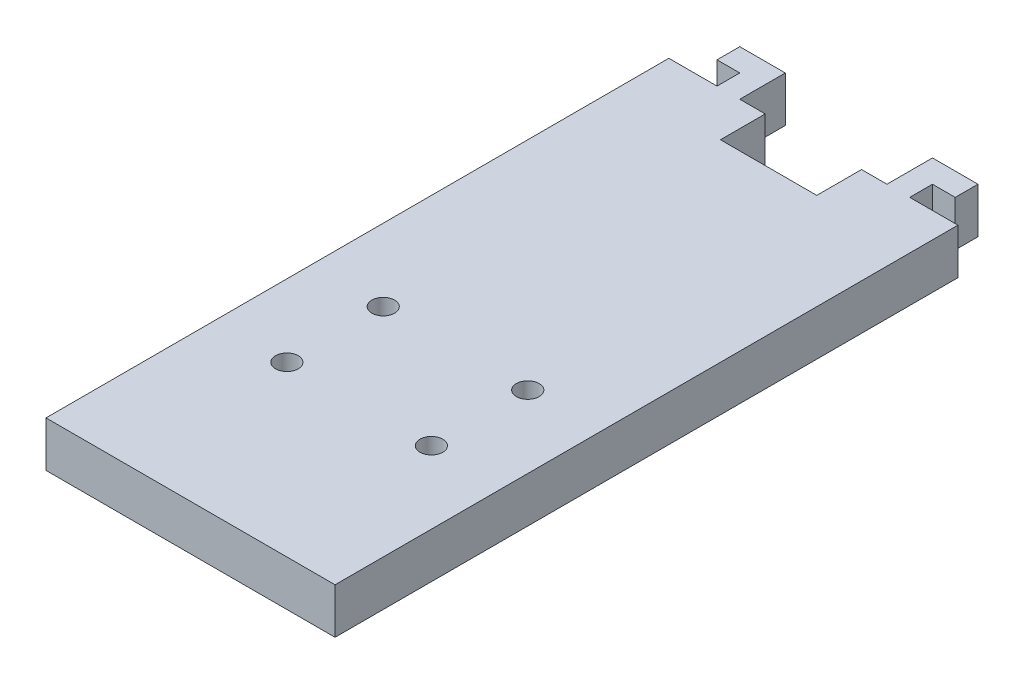
ISO-10303-21;
HEADER;
FILE_DESCRIPTION(('STEP AP214'),'2;1');
FILE_NAME('part.step','',(''),(''),'','','');
FILE_SCHEMA(('AUTOMOTIVE_DESIGN { 1 0 10303 214 1 1 1 1 }'));
ENDSEC;
DATA;
#1=APPLICATION_CONTEXT('core data for automotive mechanical design processes');
#2=APPLICATION_PROTOCOL_DEFINITION('international standard','automotive_design',2000,#1);
#3=PRODUCT_CONTEXT('',#1,'mechanical');
#4=PRODUCT('Part','Part','',(#3));
#5=PRODUCT_RELATED_PRODUCT_CATEGORY('part','',(#4));
#6=PRODUCT_DEFINITION_FORMATION('','',#4);
#7=PRODUCT_DEFINITION_CONTEXT('part definition',#1,'design');
#8=PRODUCT_DEFINITION('design','',#6,#7);
#9=PRODUCT_DEFINITION_SHAPE('','',#8);
#10=(LENGTH_UNIT() NAMED_UNIT(*) SI_UNIT(.MILLI.,.METRE.));
#11=(NAMED_UNIT(*) PLANE_ANGLE_UNIT() SI_UNIT($,.RADIAN.));
#12=(NAMED_UNIT(*) SI_UNIT($,.STERADIAN.) SOLID_ANGLE_UNIT());
#13=UNCERTAINTY_MEASURE_WITH_UNIT(LENGTH_MEASURE(1.E-05),#10,'distance_accuracy_value','');
#14=(GEOMETRIC_REPRESENTATION_CONTEXT(3) GLOBAL_UNCERTAINTY_ASSIGNED_CONTEXT((#13)) GLOBAL_UNIT_ASSIGNED_CONTEXT((#10,
#11,#12)) REPRESENTATION_CONTEXT('',''));
#15=CARTESIAN_POINT('',(0.,0.,0.));
#16=DIRECTION('',(0.,0.,1.));
#17=DIRECTION('',(1.,0.,0.));
#18=AXIS2_PLACEMENT_3D('',#15,#16,#17);
#19=CARTESIAN_POINT('',(19.0500000000001,2.999999969,0.));
#20=DIRECTION('',(1.,0.,0.));
#21=DIRECTION('',(0.,0.,-1.));
#22=AXIS2_PLACEMENT_3D('',#19,#20,#21);
#23=PLANE('',#22);
#24=DIRECTION('',(0.,0.,1.));
#25=VECTOR('',#24,1.);
#26=CARTESIAN_POINT('',(19.0500000000001,-2.999999969,0.));
#27=LINE('',#26,#25);
#28=CARTESIAN_POINT('',(19.05,-2.999999969,-43.999999884));
#29=VERTEX_POINT('',#28);
#30=CARTESIAN_POINT('',(19.05,-2.999999969,38.1));
#31=VERTEX_POINT('',#30);
#32=EDGE_CURVE('E335',#29,#31,#27,.T.);
#33=ORIENTED_EDGE('',*,*,#32,.F.);
#34=DIRECTION('',(0.,-1.,0.));
#35=VECTOR('',#34,1.);
#36=CARTESIAN_POINT('',(19.05,2.999999969,-43.999999884));
#37=LINE('',#36,#35);
#38=CARTESIAN_POINT('',(19.05,2.999999969,-43.999999884));
#39=VERTEX_POINT('',#38);
#40=EDGE_CURVE('E12',#39,#29,#37,.T.);
#41=ORIENTED_EDGE('',*,*,#40,.F.);
#42=DIRECTION('',(0.,0.,1.));
#43=VECTOR('',#42,1.);
#44=CARTESIAN_POINT('',(19.0500000000001,2.999999969,0.));
#45=LINE('',#44,#43);
#46=CARTESIAN_POINT('',(19.05,2.999999969,38.1));
#47=VERTEX_POINT('',#46);
#48=EDGE_CURVE('E395',#39,#47,#45,.T.);
#49=ORIENTED_EDGE('',*,*,#48,.T.);
#50=DIRECTION('',(0.,-1.,0.));
#51=VECTOR('',#50,1.);
#52=CARTESIAN_POINT('',(19.05,2.999999969,38.1));
#53=LINE('',#52,#51);
#54=EDGE_CURVE('E138',#47,#31,#53,.T.);
#55=ORIENTED_EDGE('',*,*,#54,.T.);
#56=EDGE_LOOP('',(#33,#41,#49,#55));
#57=FACE_BOUND('',#56,.T.);
#58=ADVANCED_FACE('F50',(#57),#23,.T.);
#59=CARTESIAN_POINT('',(0.,2.999999969,-43.999999884));
#60=DIRECTION('',(0.,0.,-1.));
#61=DIRECTION('',(-1.,0.,0.));
#62=AXIS2_PLACEMENT_3D('',#59,#60,#61);
#63=PLANE('',#62);
#64=DIRECTION('',(1.,0.,0.));
#65=VECTOR('',#64,1.);
#66=CARTESIAN_POINT('',(0.,-2.999999969,-43.999999884));
#67=LINE('',#66,#65);
#68=CARTESIAN_POINT('',(12.7,-2.999999969,-43.999999884));
#69=VERTEX_POINT('',#68);
#70=EDGE_CURVE('E327',#69,#29,#67,.T.);
#71=ORIENTED_EDGE('',*,*,#70,.F.);
#72=DIRECTION('',(0.,-1.,0.));
#73=VECTOR('',#72,1.);
#74=CARTESIAN_POINT('',(12.7,2.999999969,-43.999999884));
#75=LINE('',#74,#73);
#76=CARTESIAN_POINT('',(12.7,2.999999969,-43.999999884));
#77=VERTEX_POINT('',#76);
#78=EDGE_CURVE('E59',#77,#69,#75,.T.);
#79=ORIENTED_EDGE('',*,*,#78,.F.);
#80=DIRECTION('',(1.,0.,0.));
#81=VECTOR('',#80,1.);
#82=CARTESIAN_POINT('',(0.,2.999999969,-43.999999884));
#83=LINE('',#82,#81);
#84=EDGE_CURVE('E438',#77,#39,#83,.T.);
#85=ORIENTED_EDGE('',*,*,#84,.T.);
#86=ORIENTED_EDGE('',*,*,#40,.T.);
#87=EDGE_LOOP('',(#71,#79,#85,#86));
#88=FACE_BOUND('',#87,.T.);
#89=ADVANCED_FACE('F333',(#88),#63,.T.);
#90=CARTESIAN_POINT('',(12.7,2.999999969,0.));
#91=DIRECTION('',(-1.,0.,0.));
#92=DIRECTION('',(0.,0.,1.));
#93=AXIS2_PLACEMENT_3D('',#90,#91,#92);
#94=PLANE('',#93);
#95=DIRECTION('',(0.,0.,-1.));
#96=VECTOR('',#95,1.);
#97=CARTESIAN_POINT('',(12.7,-2.999999969,0.));
#98=LINE('',#97,#96);
#99=CARTESIAN_POINT('',(12.7,-2.999999969,-46.999999884));
#100=VERTEX_POINT('',#99);
#101=EDGE_CURVE('E316',#69,#100,#98,.T.);
#102=ORIENTED_EDGE('',*,*,#101,.T.);
#103=DIRECTION('',(0.,-1.,0.));
#104=VECTOR('',#103,1.);
#105=CARTESIAN_POINT('',(12.7,2.999999969,-46.999999884));
#106=LINE('',#105,#104);
#107=CARTESIAN_POINT('',(12.7,2.999999969,-46.999999884));
#108=VERTEX_POINT('',#107);
#109=EDGE_CURVE('E307',#108,#100,#106,.T.);
#110=ORIENTED_EDGE('',*,*,#109,.F.);
#111=DIRECTION('',(0.,0.,-1.));
#112=VECTOR('',#111,1.);
#113=CARTESIAN_POINT('',(12.7,2.999999969,0.));
#114=LINE('',#113,#112);
#115=EDGE_CURVE('E317',#77,#108,#114,.T.);
#116=ORIENTED_EDGE('',*,*,#115,.F.);
#117=ORIENTED_EDGE('',*,*,#78,.T.);
#118=EDGE_LOOP('',(#102,#110,#116,#117));
#119=FACE_BOUND('',#118,.T.);
#120=ADVANCED_FACE('F314',(#119),#94,.F.);
#121=CARTESIAN_POINT('',(0.,2.999999969,-46.999999884));
#122=DIRECTION('',(0.,0.,-1.));
#123=DIRECTION('',(-1.,0.,0.));
#124=AXIS2_PLACEMENT_3D('',#121,#122,#123);
#125=PLANE('',#124);
#126=DIRECTION('',(1.,0.,0.));
#127=VECTOR('',#126,1.);
#128=CARTESIAN_POINT('',(0.,-2.999999969,-46.999999884));
#129=LINE('',#128,#127);
#130=CARTESIAN_POINT('',(15.7,-2.999999969,-46.999999884));
#131=VERTEX_POINT('',#130);
#132=EDGE_CURVE('E330',#100,#131,#129,.T.);
#133=ORIENTED_EDGE('',*,*,#132,.T.);
#134=DIRECTION('',(0.,-1.,0.));
#135=VECTOR('',#134,1.);
#136=CARTESIAN_POINT('',(15.7,2.999999969,-46.999999884));
#137=LINE('',#136,#135);
#138=CARTESIAN_POINT('',(15.7,2.999999969,-46.999999884));
#139=VERTEX_POINT('',#138);
#140=EDGE_CURVE('E304',#139,#131,#137,.T.);
#141=ORIENTED_EDGE('',*,*,#140,.F.);
#142=DIRECTION('',(1.,0.,0.));
#143=VECTOR('',#142,1.);
#144=CARTESIAN_POINT('',(0.,2.999999969,-46.999999884));
#145=LINE('',#144,#143);
#146=EDGE_CURVE('E465',#108,#139,#145,.T.);
#147=ORIENTED_EDGE('',*,*,#146,.F.);
#148=ORIENTED_EDGE('',*,*,#109,.T.);
#149=EDGE_LOOP('',(#133,#141,#147,#148));
#150=FACE_BOUND('',#149,.T.);
#151=ADVANCED_FACE('F410',(#150),#125,.F.);
#152=CARTESIAN_POINT('',(15.6999999999999,2.999999969,0.));
#153=DIRECTION('',(1.,0.,0.));
#154=DIRECTION('',(0.,0.,-1.));
#155=AXIS2_PLACEMENT_3D('',#152,#153,#154);
#156=PLANE('',#155);
#157=DIRECTION('',(0.,0.,1.));
#158=VECTOR('',#157,1.);
#159=CARTESIAN_POINT('',(15.6999999999999,-2.999999969,0.));
#160=LINE('',#159,#158);
#161=CARTESIAN_POINT('',(15.7,-2.999999969,-49.999999884));
#162=VERTEX_POINT('',#161);
#163=EDGE_CURVE('E358',#162,#131,#160,.T.);
#164=ORIENTED_EDGE('',*,*,#163,.F.);
#165=DIRECTION('',(0.,-1.,0.));
#166=VECTOR('',#165,1.);
#167=CARTESIAN_POINT('',(15.7,2.999999969,-49.999999884));
#168=LINE('',#167,#166);
#169=CARTESIAN_POINT('',(15.7,2.999999969,-49.999999884));
#170=VERTEX_POINT('',#169);
#171=EDGE_CURVE('E301',#170,#162,#168,.T.);
#172=ORIENTED_EDGE('',*,*,#171,.F.);
#173=DIRECTION('',(0.,0.,1.));
#174=VECTOR('',#173,1.);
#175=CARTESIAN_POINT('',(15.6999999999999,2.999999969,0.));
#176=LINE('',#175,#174);
#177=EDGE_CURVE('E439',#170,#139,#176,.T.);
#178=ORIENTED_EDGE('',*,*,#177,.T.);
#179=ORIENTED_EDGE('',*,*,#140,.T.);
#180=EDGE_LOOP('',(#164,#172,#178,#179));
#181=FACE_BOUND('',#180,.T.);
#182=ADVANCED_FACE('F474',(#181),#156,.T.);
#183=CARTESIAN_POINT('',(0.,2.999999969,-49.999999884));
#184=DIRECTION('',(0.,0.,1.));
#185=DIRECTION('',(1.,0.,0.));
#186=AXIS2_PLACEMENT_3D('',#183,#184,#185);
#187=PLANE('',#186);
#188=DIRECTION('',(-1.,0.,0.));
#189=VECTOR('',#188,1.);
#190=CARTESIAN_POINT('',(0.,-2.999999969,-49.999999884));
#191=LINE('',#190,#189);
#192=CARTESIAN_POINT('',(9.69999999999998,-2.999999969,-49.999999884));
#193=VERTEX_POINT('',#192);
#194=EDGE_CURVE('E353',#162,#193,#191,.T.);
#195=ORIENTED_EDGE('',*,*,#194,.T.);
#196=DIRECTION('',(0.,-1.,0.));
#197=VECTOR('',#196,1.);
#198=CARTESIAN_POINT('',(9.69999999999998,2.999999969,-49.999999884));
#199=LINE('',#198,#197);
#200=CARTESIAN_POINT('',(9.69999999999998,2.999999969,-49.999999884));
#201=VERTEX_POINT('',#200);
#202=EDGE_CURVE('E297',#201,#193,#199,.T.);
#203=ORIENTED_EDGE('',*,*,#202,.F.);
#204=DIRECTION('',(-1.,0.,0.));
#205=VECTOR('',#204,1.);
#206=CARTESIAN_POINT('',(0.,2.999999969,-49.999999884));
#207=LINE('',#206,#205);
#208=EDGE_CURVE('E432',#170,#201,#207,.T.);
#209=ORIENTED_EDGE('',*,*,#208,.F.);
#210=ORIENTED_EDGE('',*,*,#171,.T.);
#211=EDGE_LOOP('',(#195,#203,#209,#210));
#212=FACE_BOUND('',#211,.T.);
#213=ADVANCED_FACE('F423',(#212),#187,.F.);
#214=CARTESIAN_POINT('',(9.69999999999998,2.999999969,0.));
#215=DIRECTION('',(1.,0.,0.));
#216=DIRECTION('',(0.,0.,-1.));
#217=AXIS2_PLACEMENT_3D('',#214,#215,#216);
#218=PLANE('',#217);
#219=DIRECTION('',(0.,0.,1.));
#220=VECTOR('',#219,1.);
#221=CARTESIAN_POINT('',(9.69999999999998,-2.999999969,0.));
#222=LINE('',#221,#220);
#223=CARTESIAN_POINT('',(9.69999999999998,-2.999999969,-43.999999884));
#224=VERTEX_POINT('',#223);
#225=EDGE_CURVE('E343',#193,#224,#222,.T.);
#226=ORIENTED_EDGE('',*,*,#225,.T.);
#227=DIRECTION('',(0.,-1.,0.));
#228=VECTOR('',#227,1.);
#229=CARTESIAN_POINT('',(9.69999999999998,2.999999969,-43.999999884));
#230=LINE('',#229,#228);
#231=CARTESIAN_POINT('',(9.69999999999998,2.999999969,-43.999999884));
#232=VERTEX_POINT('',#231);
#233=EDGE_CURVE('E294',#232,#224,#230,.T.);
#234=ORIENTED_EDGE('',*,*,#233,.F.);
#235=DIRECTION('',(0.,0.,1.));
#236=VECTOR('',#235,1.);
#237=CARTESIAN_POINT('',(9.69999999999998,2.999999969,0.));
#238=LINE('',#237,#236);
#239=EDGE_CURVE('E429',#201,#232,#238,.T.);
#240=ORIENTED_EDGE('',*,*,#239,.F.);
#241=ORIENTED_EDGE('',*,*,#202,.T.);
#242=EDGE_LOOP('',(#226,#234,#240,#241));
#243=FACE_BOUND('',#242,.T.);
#244=ADVANCED_FACE('F415',(#243),#218,.F.);
#245=CARTESIAN_POINT('',(6.34999999999998,-2.999999969,-43.999999884));
#246=VERTEX_POINT('',#245);
#247=EDGE_CURVE('E337',#246,#224,#67,.T.);
#248=ORIENTED_EDGE('',*,*,#247,.F.);
#249=DIRECTION('',(0.,-1.,0.));
#250=VECTOR('',#249,1.);
#251=CARTESIAN_POINT('',(6.34999999999998,2.999999969,-43.999999884));
#252=LINE('',#251,#250);
#253=CARTESIAN_POINT('',(6.34999999999998,2.999999969,-43.999999884));
#254=VERTEX_POINT('',#253);
#255=EDGE_CURVE('E291',#254,#246,#252,.T.);
#256=ORIENTED_EDGE('',*,*,#255,.F.);
#257=EDGE_CURVE('E427',#254,#232,#83,.T.);
#258=ORIENTED_EDGE('',*,*,#257,.T.);
#259=ORIENTED_EDGE('',*,*,#233,.T.);
#260=EDGE_LOOP('',(#248,#256,#258,#259));
#261=FACE_BOUND('',#260,.T.);
#262=ADVANCED_FACE('F406',(#261),#63,.T.);
#263=CARTESIAN_POINT('',(6.35000000000004,2.999999969,0.));
#264=DIRECTION('',(1.,0.,0.));
#265=DIRECTION('',(0.,0.,-1.));
#266=AXIS2_PLACEMENT_3D('',#263,#264,#265);
#267=PLANE('',#266);
#268=DIRECTION('',(0.,0.,1.));
#269=VECTOR('',#268,1.);
#270=CARTESIAN_POINT('',(6.35000000000004,-2.999999969,0.));
#271=LINE('',#270,#269);
#272=CARTESIAN_POINT('',(6.34999999999999,-2.999999969,-38.1));
#273=VERTEX_POINT('',#272);
#274=EDGE_CURVE('E342',#246,#273,#271,.T.);
#275=ORIENTED_EDGE('',*,*,#274,.T.);
#276=DIRECTION('',(0.,-1.,0.));
#277=VECTOR('',#276,1.);
#278=CARTESIAN_POINT('',(6.34999999999999,2.999999969,-38.1));
#279=LINE('',#278,#277);
#280=CARTESIAN_POINT('',(6.34999999999999,2.999999969,-38.1));
#281=VERTEX_POINT('',#280);
#282=EDGE_CURVE('E288',#281,#273,#279,.T.);
#283=ORIENTED_EDGE('',*,*,#282,.F.);
#284=DIRECTION('',(0.,0.,1.));
#285=VECTOR('',#284,1.);
#286=CARTESIAN_POINT('',(6.35000000000004,2.999999969,0.));
#287=LINE('',#286,#285);
#288=EDGE_CURVE('E436',#254,#281,#287,.T.);
#289=ORIENTED_EDGE('',*,*,#288,.F.);
#290=ORIENTED_EDGE('',*,*,#255,.T.);
#291=EDGE_LOOP('',(#275,#283,#289,#290));
#292=FACE_BOUND('',#291,.T.);
#293=ADVANCED_FACE('F414',(#292),#267,.F.);
#294=CARTESIAN_POINT('',(0.,2.999999969,-38.1));
#295=DIRECTION('',(0.,0.,-1.));
#296=DIRECTION('',(-1.,0.,0.));
#297=AXIS2_PLACEMENT_3D('',#294,#295,#296);
#298=PLANE('',#297);
#299=DIRECTION('',(1.,0.,0.));
#300=VECTOR('',#299,1.);
#301=CARTESIAN_POINT('',(0.,-2.999999969,-38.1));
#302=LINE('',#301,#300);
#303=CARTESIAN_POINT('',(-6.35000000000001,-2.999999969,-38.1));
#304=VERTEX_POINT('',#303);
#305=EDGE_CURVE('E350',#304,#273,#302,.T.);
#306=ORIENTED_EDGE('',*,*,#305,.F.);
#307=DIRECTION('',(0.,-1.,0.));
#308=VECTOR('',#307,1.);
#309=CARTESIAN_POINT('',(-6.35000000000001,2.999999969,-38.1));
#310=LINE('',#309,#308);
#311=CARTESIAN_POINT('',(-6.35000000000001,2.999999969,-38.1));
#312=VERTEX_POINT('',#311);
#313=EDGE_CURVE('E285',#312,#304,#310,.T.);
#314=ORIENTED_EDGE('',*,*,#313,.F.);
#315=DIRECTION('',(1.,0.,0.));
#316=VECTOR('',#315,1.);
#317=CARTESIAN_POINT('',(0.,2.999999969,-38.1));
#318=LINE('',#317,#316);
#319=EDGE_CURVE('E784',#312,#281,#318,.T.);
#320=ORIENTED_EDGE('',*,*,#319,.T.);
#321=ORIENTED_EDGE('',*,*,#282,.T.);
#322=EDGE_LOOP('',(#306,#314,#320,#321));
#323=FACE_BOUND('',#322,.T.);
#324=ADVANCED_FACE('F421',(#323),#298,.T.);
#325=CARTESIAN_POINT('',(-6.34999999999995,2.999999969,0.));
#326=DIRECTION('',(1.,0.,0.));
#327=DIRECTION('',(0.,0.,-1.));
#328=AXIS2_PLACEMENT_3D('',#325,#326,#327);
#329=PLANE('',#328);
#330=DIRECTION('',(0.,0.,1.));
#331=VECTOR('',#330,1.);
#332=CARTESIAN_POINT('',(-6.34999999999995,-2.999999969,0.));
#333=LINE('',#332,#331);
#334=CARTESIAN_POINT('',(-6.35000000000002,-2.999999969,-43.999999884));
#335=VERTEX_POINT('',#334);
#336=EDGE_CURVE('E365',#335,#304,#333,.T.);
#337=ORIENTED_EDGE('',*,*,#336,.F.);
#338=DIRECTION('',(0.,-1.,0.));
#339=VECTOR('',#338,1.);
#340=CARTESIAN_POINT('',(-6.35000000000002,2.999999969,-43.999999884));
#341=LINE('',#340,#339);
#342=CARTESIAN_POINT('',(-6.35000000000002,2.999999969,-43.999999884));
#343=VERTEX_POINT('',#342);
#344=EDGE_CURVE('E282',#343,#335,#341,.T.);
#345=ORIENTED_EDGE('',*,*,#344,.F.);
#346=DIRECTION('',(0.,0.,1.));
#347=VECTOR('',#346,1.);
#348=CARTESIAN_POINT('',(-6.34999999999995,2.999999969,0.));
#349=LINE('',#348,#347);
#350=EDGE_CURVE('E231',#343,#312,#349,.T.);
#351=ORIENTED_EDGE('',*,*,#350,.T.);
#352=ORIENTED_EDGE('',*,*,#313,.T.);
#353=EDGE_LOOP('',(#337,#345,#351,#352));
#354=FACE_BOUND('',#353,.T.);
#355=ADVANCED_FACE('F534',(#354),#329,.T.);
#356=CARTESIAN_POINT('',(0.,2.999999969,-43.999999884));
#357=DIRECTION('',(0.,0.,1.));
#358=DIRECTION('',(1.,0.,0.));
#359=AXIS2_PLACEMENT_3D('',#356,#357,#358);
#360=PLANE('',#359);
#361=DIRECTION('',(-1.,0.,0.));
#362=VECTOR('',#361,1.);
#363=CARTESIAN_POINT('',(0.,-2.999999969,-43.999999884));
#364=LINE('',#363,#362);
#365=CARTESIAN_POINT('',(-9.7,-2.999999969,-43.999999884));
#366=VERTEX_POINT('',#365);
#367=EDGE_CURVE('E369',#335,#366,#364,.T.);
#368=ORIENTED_EDGE('',*,*,#367,.T.);
#369=DIRECTION('',(0.,-1.,0.));
#370=VECTOR('',#369,1.);
#371=CARTESIAN_POINT('',(-9.7,2.999999969,-43.999999884));
#372=LINE('',#371,#370);
#373=CARTESIAN_POINT('',(-9.7,2.999999969,-43.999999884));
#374=VERTEX_POINT('',#373);
#375=EDGE_CURVE('E279',#374,#366,#372,.T.);
#376=ORIENTED_EDGE('',*,*,#375,.F.);
#377=DIRECTION('',(-1.,0.,0.));
#378=VECTOR('',#377,1.);
#379=CARTESIAN_POINT('',(0.,2.999999969,-43.999999884));
#380=LINE('',#379,#378);
#381=EDGE_CURVE('E204',#343,#374,#380,.T.);
#382=ORIENTED_EDGE('',*,*,#381,.F.);
#383=ORIENTED_EDGE('',*,*,#344,.T.);
#384=EDGE_LOOP('',(#368,#376,#382,#383));
#385=FACE_BOUND('',#384,.T.);
#386=ADVANCED_FACE('F544',(#385),#360,.F.);
#387=CARTESIAN_POINT('',(-9.7,2.999999969,0.));
#388=DIRECTION('',(1.,0.,0.));
#389=DIRECTION('',(0.,0.,-1.));
#390=AXIS2_PLACEMENT_3D('',#387,#388,#389);
#391=PLANE('',#390);
#392=DIRECTION('',(0.,0.,1.));
#393=VECTOR('',#392,1.);
#394=CARTESIAN_POINT('',(-9.7,-2.999999969,0.));
#395=LINE('',#394,#393);
#396=CARTESIAN_POINT('',(-9.7,-2.999999969,-49.999999884));
#397=VERTEX_POINT('',#396);
#398=EDGE_CURVE('E373',#397,#366,#395,.T.);
#399=ORIENTED_EDGE('',*,*,#398,.F.);
#400=DIRECTION('',(0.,-1.,0.));
#401=VECTOR('',#400,1.);
#402=CARTESIAN_POINT('',(-9.7,2.999999969,-49.999999884));
#403=LINE('',#402,#401);
#404=CARTESIAN_POINT('',(-9.7,2.999999969,-49.999999884));
#405=VERTEX_POINT('',#404);
#406=EDGE_CURVE('E276',#405,#397,#403,.T.);
#407=ORIENTED_EDGE('',*,*,#406,.F.);
#408=DIRECTION('',(0.,0.,1.));
#409=VECTOR('',#408,1.);
#410=CARTESIAN_POINT('',(-9.7,2.999999969,0.));
#411=LINE('',#410,#409);
#412=EDGE_CURVE('E230',#405,#374,#411,.T.);
#413=ORIENTED_EDGE('',*,*,#412,.T.);
#414=ORIENTED_EDGE('',*,*,#375,.T.);
#415=EDGE_LOOP('',(#399,#407,#413,#414));
#416=FACE_BOUND('',#415,.T.);
#417=ADVANCED_FACE('F554',(#416),#391,.T.);
#418=CARTESIAN_POINT('',(0.,2.999999969,-49.999999884));
#419=DIRECTION('',(0.,0.,1.));
#420=DIRECTION('',(1.,0.,0.));
#421=AXIS2_PLACEMENT_3D('',#418,#419,#420);
#422=PLANE('',#421);
#423=DIRECTION('',(-1.,0.,0.));
#424=VECTOR('',#423,1.);
#425=CARTESIAN_POINT('',(0.,-2.999999969,-49.999999884));
#426=LINE('',#425,#424);
#427=CARTESIAN_POINT('',(-15.7,-2.999999969,-49.999999884));
#428=VERTEX_POINT('',#427);
#429=EDGE_CURVE('E377',#397,#428,#426,.T.);
#430=ORIENTED_EDGE('',*,*,#429,.T.);
#431=DIRECTION('',(0.,-1.,0.));
#432=VECTOR('',#431,1.);
#433=CARTESIAN_POINT('',(-15.7,2.999999969,-49.999999884));
#434=LINE('',#433,#432);
#435=CARTESIAN_POINT('',(-15.7,2.999999969,-49.999999884));
#436=VERTEX_POINT('',#435);
#437=EDGE_CURVE('E272',#436,#428,#434,.T.);
#438=ORIENTED_EDGE('',*,*,#437,.F.);
#439=DIRECTION('',(-1.,0.,0.));
#440=VECTOR('',#439,1.);
#441=CARTESIAN_POINT('',(0.,2.999999969,-49.999999884));
#442=LINE('',#441,#440);
#443=EDGE_CURVE('E244',#405,#436,#442,.T.);
#444=ORIENTED_EDGE('',*,*,#443,.F.);
#445=ORIENTED_EDGE('',*,*,#406,.T.);
#446=EDGE_LOOP('',(#430,#438,#444,#445));
#447=FACE_BOUND('',#446,.T.);
#448=ADVANCED_FACE('F567',(#447),#422,.F.);
#449=CARTESIAN_POINT('',(-15.7,2.999999969,0.));
#450=DIRECTION('',(1.,0.,0.));
#451=DIRECTION('',(0.,0.,-1.));
#452=AXIS2_PLACEMENT_3D('',#449,#450,#451);
#453=PLANE('',#452);
#454=DIRECTION('',(0.,0.,1.));
#455=VECTOR('',#454,1.);
#456=CARTESIAN_POINT('',(-15.7,-2.999999969,0.));
#457=LINE('',#456,#455);
#458=CARTESIAN_POINT('',(-15.7,-2.999999969,-46.999999884));
#459=VERTEX_POINT('',#458);
#460=EDGE_CURVE('E380',#428,#459,#457,.T.);
#461=ORIENTED_EDGE('',*,*,#460,.T.);
#462=DIRECTION('',(0.,-1.,0.));
#463=VECTOR('',#462,1.);
#464=CARTESIAN_POINT('',(-15.7,2.999999969,-46.999999884));
#465=LINE('',#464,#463);
#466=CARTESIAN_POINT('',(-15.7,2.999999969,-46.999999884));
#467=VERTEX_POINT('',#466);
#468=EDGE_CURVE('E266',#467,#459,#465,.T.);
#469=ORIENTED_EDGE('',*,*,#468,.F.);
#470=DIRECTION('',(0.,0.,1.));
#471=VECTOR('',#470,1.);
#472=CARTESIAN_POINT('',(-15.7,2.999999969,0.));
#473=LINE('',#472,#471);
#474=EDGE_CURVE('E247',#436,#467,#473,.T.);
#475=ORIENTED_EDGE('',*,*,#474,.F.);
#476=ORIENTED_EDGE('',*,*,#437,.T.);
#477=EDGE_LOOP('',(#461,#469,#475,#476));
#478=FACE_BOUND('',#477,.T.);
#479=ADVANCED_FACE('F577',(#478),#453,.F.);
#480=CARTESIAN_POINT('',(-1.08709337559576E-13,2.999999969,-46.999999884));
#481=DIRECTION('',(0.,0.,1.));
#482=DIRECTION('',(1.,0.,0.));
#483=AXIS2_PLACEMENT_3D('',#480,#481,#482);
#484=PLANE('',#483);
#485=DIRECTION('',(-1.,0.,0.));
#486=VECTOR('',#485,1.);
#487=CARTESIAN_POINT('',(-1.08709337559576E-13,-2.999999969,-46.999999884));
#488=LINE('',#487,#486);
#489=CARTESIAN_POINT('',(-12.7,-2.999999969,-46.999999884));
#490=VERTEX_POINT('',#489);
#491=EDGE_CURVE('E384',#490,#459,#488,.T.);
#492=ORIENTED_EDGE('',*,*,#491,.F.);
#493=DIRECTION('',(0.,-1.,0.));
#494=VECTOR('',#493,1.);
#495=CARTESIAN_POINT('',(-12.7,2.999999969,-46.999999884));
#496=LINE('',#495,#494);
#497=CARTESIAN_POINT('',(-12.7,2.999999969,-46.999999884));
#498=VERTEX_POINT('',#497);
#499=EDGE_CURVE('E259',#498,#490,#496,.T.);
#500=ORIENTED_EDGE('',*,*,#499,.F.);
#501=DIRECTION('',(-1.,0.,0.));
#502=VECTOR('',#501,1.);
#503=CARTESIAN_POINT('',(-1.08709337559576E-13,2.999999969,-46.999999884));
#504=LINE('',#503,#502);
#505=EDGE_CURVE('E250',#498,#467,#504,.T.);
#506=ORIENTED_EDGE('',*,*,#505,.T.);
#507=ORIENTED_EDGE('',*,*,#468,.T.);
#508=EDGE_LOOP('',(#492,#500,#506,#507));
#509=FACE_BOUND('',#508,.T.);
#510=ADVANCED_FACE('F587',(#509),#484,.T.);
#511=CARTESIAN_POINT('',(-12.7,2.999999969,0.));
#512=DIRECTION('',(-1.,0.,0.));
#513=DIRECTION('',(0.,0.,1.));
#514=AXIS2_PLACEMENT_3D('',#511,#512,#513);
#515=PLANE('',#514);
#516=DIRECTION('',(0.,0.,-1.));
#517=VECTOR('',#516,1.);
#518=CARTESIAN_POINT('',(-12.7,-2.999999969,0.));
#519=LINE('',#518,#517);
#520=CARTESIAN_POINT('',(-12.7,-2.999999969,-43.999999884));
#521=VERTEX_POINT('',#520);
#522=EDGE_CURVE('E262',#521,#490,#519,.T.);
#523=ORIENTED_EDGE('',*,*,#522,.F.);
#524=DIRECTION('',(0.,-1.,0.));
#525=VECTOR('',#524,1.);
#526=CARTESIAN_POINT('',(-12.7,2.999999969,-43.999999884));
#527=LINE('',#526,#525);
#528=CARTESIAN_POINT('',(-12.7,2.999999969,-43.999999884));
#529=VERTEX_POINT('',#528);
#530=EDGE_CURVE('E210',#529,#521,#527,.T.);
#531=ORIENTED_EDGE('',*,*,#530,.F.);
#532=DIRECTION('',(0.,0.,-1.));
#533=VECTOR('',#532,1.);
#534=CARTESIAN_POINT('',(-12.7,2.999999969,0.));
#535=LINE('',#534,#533);
#536=EDGE_CURVE('E200',#529,#498,#535,.T.);
#537=ORIENTED_EDGE('',*,*,#536,.T.);
#538=ORIENTED_EDGE('',*,*,#499,.T.);
#539=EDGE_LOOP('',(#523,#531,#537,#538));
#540=FACE_BOUND('',#539,.T.);
#541=ADVANCED_FACE('F258',(#540),#515,.T.);
#542=CARTESIAN_POINT('',(-19.05,-2.999999969,-43.999999884));
#543=VERTEX_POINT('',#542);
#544=EDGE_CURVE('E208',#521,#543,#364,.T.);
#545=ORIENTED_EDGE('',*,*,#544,.T.);
#546=DIRECTION('',(0.,-1.,0.));
#547=VECTOR('',#546,1.);
#548=CARTESIAN_POINT('',(-19.05,2.999999969,-43.999999884));
#549=LINE('',#548,#547);
#550=CARTESIAN_POINT('',(-19.05,2.999999969,-43.999999884));
#551=VERTEX_POINT('',#550);
#552=EDGE_CURVE('E205',#551,#543,#549,.T.);
#553=ORIENTED_EDGE('',*,*,#552,.F.);
#554=EDGE_CURVE('E193',#529,#551,#380,.T.);
#555=ORIENTED_EDGE('',*,*,#554,.F.);
#556=ORIENTED_EDGE('',*,*,#530,.T.);
#557=EDGE_LOOP('',(#545,#553,#555,#556));
#558=FACE_BOUND('',#557,.T.);
#559=ADVANCED_FACE('F206',(#558),#360,.F.);
#560=CARTESIAN_POINT('',(-19.0499999999999,2.999999969,0.));
#561=DIRECTION('',(1.,0.,0.));
#562=DIRECTION('',(0.,0.,-1.));
#563=AXIS2_PLACEMENT_3D('',#560,#561,#562);
#564=PLANE('',#563);
#565=DIRECTION('',(0.,0.,1.));
#566=VECTOR('',#565,1.);
#567=CARTESIAN_POINT('',(-19.0499999999999,-2.999999969,0.));
#568=LINE('',#567,#566);
#569=CARTESIAN_POINT('',(-19.05,-2.999999969,38.1));
#570=VERTEX_POINT('',#569);
#571=EDGE_CURVE('E131',#543,#570,#568,.T.);
#572=ORIENTED_EDGE('',*,*,#571,.T.);
#573=DIRECTION('',(0.,-1.,0.));
#574=VECTOR('',#573,1.);
#575=CARTESIAN_POINT('',(-19.05,2.999999969,38.1));
#576=LINE('',#575,#574);
#577=CARTESIAN_POINT('',(-19.05,2.999999969,38.1));
#578=VERTEX_POINT('',#577);
#579=EDGE_CURVE('E211',#578,#570,#576,.T.);
#580=ORIENTED_EDGE('',*,*,#579,.F.);
#581=DIRECTION('',(0.,0.,1.));
#582=VECTOR('',#581,1.);
#583=CARTESIAN_POINT('',(-19.0499999999999,2.999999969,0.));
#584=LINE('',#583,#582);
#585=EDGE_CURVE('E197',#551,#578,#584,.T.);
#586=ORIENTED_EDGE('',*,*,#585,.F.);
#587=ORIENTED_EDGE('',*,*,#552,.T.);
#588=EDGE_LOOP('',(#572,#580,#586,#587));
#589=FACE_BOUND('',#588,.T.);
#590=ADVANCED_FACE('F213',(#589),#564,.F.);
#591=CARTESIAN_POINT('',(0.,2.999999969,38.1));
#592=DIRECTION('',(0.,0.,-1.));
#593=DIRECTION('',(-1.,0.,0.));
#594=AXIS2_PLACEMENT_3D('',#591,#592,#593);
#595=PLANE('',#594);
#596=DIRECTION('',(1.,0.,0.));
#597=VECTOR('',#596,1.);
#598=CARTESIAN_POINT('',(0.,-2.999999969,38.1));
#599=LINE('',#598,#597);
#600=EDGE_CURVE('E392',#570,#31,#599,.T.);
#601=ORIENTED_EDGE('',*,*,#600,.T.);
#602=ORIENTED_EDGE('',*,*,#54,.F.);
#603=DIRECTION('',(1.,0.,0.));
#604=VECTOR('',#603,1.);
#605=CARTESIAN_POINT('',(0.,2.999999969,38.1));
#606=LINE('',#605,#604);
#607=EDGE_CURVE('E67',#578,#47,#606,.T.);
#608=ORIENTED_EDGE('',*,*,#607,.F.);
#609=ORIENTED_EDGE('',*,*,#579,.T.);
#610=EDGE_LOOP('',(#601,#602,#608,#609));
#611=FACE_BOUND('',#610,.T.);
#612=ADVANCED_FACE('F400',(#611),#595,.F.);
#613=CARTESIAN_POINT('',(0.,2.999999969,0.));
#614=DIRECTION('',(0.,1.,0.));
#615=DIRECTION('',(0.,0.,1.));
#616=AXIS2_PLACEMENT_3D('',#613,#614,#615);
#617=PLANE('',#616);
#618=CARTESIAN_POINT('',(-9.525,2.999999969,15.875));
#619=DIRECTION('',(0.,1.,0.));
#620=DIRECTION('',(0.,0.,1.));
#621=AXIS2_PLACEMENT_3D('',#618,#619,#620);
#622=CIRCLE('',#621,1.5);
#623=CARTESIAN_POINT('',(-9.525,2.999999969,17.375));
#624=VERTEX_POINT('',#623);
#625=EDGE_CURVE('E339',#624,#624,#622,.T.);
#626=ORIENTED_EDGE('',*,*,#625,.F.);
#627=EDGE_LOOP('',(#626));
#628=FACE_BOUND('',#627,.T.);
#629=CARTESIAN_POINT('',(9.525,2.999999969,15.875));
#630=DIRECTION('',(0.,1.,0.));
#631=DIRECTION('',(0.,0.,1.));
#632=AXIS2_PLACEMENT_3D('',#629,#630,#631);
#633=CIRCLE('',#632,1.5);
#634=CARTESIAN_POINT('',(9.525,2.999999969,17.375));
#635=VERTEX_POINT('',#634);
#636=EDGE_CURVE('E736',#635,#635,#633,.T.);
#637=ORIENTED_EDGE('',*,*,#636,.F.);
#638=EDGE_LOOP('',(#637));
#639=FACE_BOUND('',#638,.T.);
#640=CARTESIAN_POINT('',(9.525,2.999999969,3.17499999999999));
#641=DIRECTION('',(0.,1.,0.));
#642=DIRECTION('',(0.,0.,1.));
#643=AXIS2_PLACEMENT_3D('',#640,#641,#642);
#644=CIRCLE('',#643,1.5);
#645=CARTESIAN_POINT('',(9.525,2.999999969,4.67499999999999));
#646=VERTEX_POINT('',#645);
#647=EDGE_CURVE('E730',#646,#646,#644,.T.);
#648=ORIENTED_EDGE('',*,*,#647,.F.);
#649=EDGE_LOOP('',(#648));
#650=FACE_BOUND('',#649,.T.);
#651=CARTESIAN_POINT('',(-9.525,2.999999969,3.17499999999999));
#652=DIRECTION('',(0.,1.,0.));
#653=DIRECTION('',(0.,0.,1.));
#654=AXIS2_PLACEMENT_3D('',#651,#652,#653);
#655=CIRCLE('',#654,1.5);
#656=CARTESIAN_POINT('',(-9.525,2.999999969,4.67499999999999));
#657=VERTEX_POINT('',#656);
#658=EDGE_CURVE('E725',#657,#657,#655,.T.);
#659=ORIENTED_EDGE('',*,*,#658,.F.);
#660=EDGE_LOOP('',(#659));
#661=FACE_BOUND('',#660,.T.);
#662=ORIENTED_EDGE('',*,*,#48,.F.);
#663=ORIENTED_EDGE('',*,*,#84,.F.);
#664=ORIENTED_EDGE('',*,*,#115,.T.);
#665=ORIENTED_EDGE('',*,*,#146,.T.);
#666=ORIENTED_EDGE('',*,*,#177,.F.);
#667=ORIENTED_EDGE('',*,*,#208,.T.);
#668=ORIENTED_EDGE('',*,*,#239,.T.);
#669=ORIENTED_EDGE('',*,*,#257,.F.);
#670=ORIENTED_EDGE('',*,*,#288,.T.);
#671=ORIENTED_EDGE('',*,*,#319,.F.);
#672=ORIENTED_EDGE('',*,*,#350,.F.);
#673=ORIENTED_EDGE('',*,*,#381,.T.);
#674=ORIENTED_EDGE('',*,*,#412,.F.);
#675=ORIENTED_EDGE('',*,*,#443,.T.);
#676=ORIENTED_EDGE('',*,*,#474,.T.);
#677=ORIENTED_EDGE('',*,*,#505,.F.);
#678=ORIENTED_EDGE('',*,*,#536,.F.);
#679=ORIENTED_EDGE('',*,*,#554,.T.);
#680=ORIENTED_EDGE('',*,*,#585,.T.);
#681=ORIENTED_EDGE('',*,*,#607,.T.);
#682=EDGE_LOOP('',(#662,#663,#664,#665,#666,#667,#668,#669,#670,#671,#672,#673,#674,#675,#676,
#677,#678,#679,#680,#681));
#683=FACE_BOUND('',#682,.T.);
#684=ADVANCED_FACE('F195',(#628,#639,#650,#661,#683),#617,.T.);
#685=CARTESIAN_POINT('',(0.,-2.999999969,0.));
#686=DIRECTION('',(0.,1.,0.));
#687=DIRECTION('',(0.,0.,1.));
#688=AXIS2_PLACEMENT_3D('',#685,#686,#687);
#689=PLANE('',#688);
#690=CARTESIAN_POINT('',(-9.525,-2.999999969,15.875));
#691=DIRECTION('',(0.,1.,0.));
#692=DIRECTION('',(0.,0.,1.));
#693=AXIS2_PLACEMENT_3D('',#690,#691,#692);
#694=CIRCLE('',#693,1.5);
#695=CARTESIAN_POINT('',(-9.525,-2.999999969,17.375));
#696=VERTEX_POINT('',#695);
#697=EDGE_CURVE('E711',#696,#696,#694,.T.);
#698=ORIENTED_EDGE('',*,*,#697,.T.);
#699=EDGE_LOOP('',(#698));
#700=FACE_BOUND('',#699,.T.);
#701=CARTESIAN_POINT('',(9.525,-2.999999969,15.875));
#702=DIRECTION('',(0.,1.,0.));
#703=DIRECTION('',(0.,0.,1.));
#704=AXIS2_PLACEMENT_3D('',#701,#702,#703);
#705=CIRCLE('',#704,1.5);
#706=CARTESIAN_POINT('',(9.525,-2.999999969,17.375));
#707=VERTEX_POINT('',#706);
#708=EDGE_CURVE('E713',#707,#707,#705,.T.);
#709=ORIENTED_EDGE('',*,*,#708,.T.);
#710=EDGE_LOOP('',(#709));
#711=FACE_BOUND('',#710,.T.);
#712=CARTESIAN_POINT('',(9.525,-2.999999969,3.17499999999999));
#713=DIRECTION('',(0.,1.,0.));
#714=DIRECTION('',(0.,0.,1.));
#715=AXIS2_PLACEMENT_3D('',#712,#713,#714);
#716=CIRCLE('',#715,1.5);
#717=CARTESIAN_POINT('',(9.525,-2.999999969,4.67499999999999));
#718=VERTEX_POINT('',#717);
#719=EDGE_CURVE('E717',#718,#718,#716,.T.);
#720=ORIENTED_EDGE('',*,*,#719,.T.);
#721=EDGE_LOOP('',(#720));
#722=FACE_BOUND('',#721,.T.);
#723=CARTESIAN_POINT('',(-9.525,-2.999999969,3.17499999999999));
#724=DIRECTION('',(0.,1.,0.));
#725=DIRECTION('',(0.,0.,1.));
#726=AXIS2_PLACEMENT_3D('',#723,#724,#725);
#727=CIRCLE('',#726,1.5);
#728=CARTESIAN_POINT('',(-9.525,-2.999999969,4.67499999999999));
#729=VERTEX_POINT('',#728);
#730=EDGE_CURVE('E721',#729,#729,#727,.T.);
#731=ORIENTED_EDGE('',*,*,#730,.T.);
#732=EDGE_LOOP('',(#731));
#733=FACE_BOUND('',#732,.T.);
#734=ORIENTED_EDGE('',*,*,#32,.T.);
#735=ORIENTED_EDGE('',*,*,#600,.F.);
#736=ORIENTED_EDGE('',*,*,#571,.F.);
#737=ORIENTED_EDGE('',*,*,#544,.F.);
#738=ORIENTED_EDGE('',*,*,#522,.T.);
#739=ORIENTED_EDGE('',*,*,#491,.T.);
#740=ORIENTED_EDGE('',*,*,#460,.F.);
#741=ORIENTED_EDGE('',*,*,#429,.F.);
#742=ORIENTED_EDGE('',*,*,#398,.T.);
#743=ORIENTED_EDGE('',*,*,#367,.F.);
#744=ORIENTED_EDGE('',*,*,#336,.T.);
#745=ORIENTED_EDGE('',*,*,#305,.T.);
#746=ORIENTED_EDGE('',*,*,#274,.F.);
#747=ORIENTED_EDGE('',*,*,#247,.T.);
#748=ORIENTED_EDGE('',*,*,#225,.F.);
#749=ORIENTED_EDGE('',*,*,#194,.F.);
#750=ORIENTED_EDGE('',*,*,#163,.T.);
#751=ORIENTED_EDGE('',*,*,#132,.F.);
#752=ORIENTED_EDGE('',*,*,#101,.F.);
#753=ORIENTED_EDGE('',*,*,#70,.T.);
#754=EDGE_LOOP('',(#734,#735,#736,#737,#738,#739,#740,#741,#742,#743,#744,#745,#746,#747,#748,
#749,#750,#751,#752,#753));
#755=FACE_BOUND('',#754,.T.);
#756=ADVANCED_FACE('F326',(#700,#711,#722,#733,#755),#689,.F.);
#757=CARTESIAN_POINT('',(-9.525,-2.999999969,3.17499999999999));
#758=DIRECTION('',(0.,1.,0.));
#759=DIRECTION('',(0.,0.,1.));
#760=AXIS2_PLACEMENT_3D('',#757,#758,#759);
#761=CYLINDRICAL_SURFACE('',#760,1.5);
#762=ORIENTED_EDGE('',*,*,#658,.T.);
#763=EDGE_LOOP('',(#762));
#764=FACE_BOUND('',#763,.T.);
#765=ORIENTED_EDGE('',*,*,#730,.F.);
#766=EDGE_LOOP('',(#765));
#767=FACE_BOUND('',#766,.T.);
#768=ADVANCED_FACE('F657',(#764,#767),#761,.F.);
#769=CARTESIAN_POINT('',(9.525,-2.999999969,3.17499999999999));
#770=DIRECTION('',(0.,1.,0.));
#771=DIRECTION('',(0.,0.,1.));
#772=AXIS2_PLACEMENT_3D('',#769,#770,#771);
#773=CYLINDRICAL_SURFACE('',#772,1.5);
#774=ORIENTED_EDGE('',*,*,#647,.T.);
#775=EDGE_LOOP('',(#774));
#776=FACE_BOUND('',#775,.T.);
#777=ORIENTED_EDGE('',*,*,#719,.F.);
#778=EDGE_LOOP('',(#777));
#779=FACE_BOUND('',#778,.T.);
#780=ADVANCED_FACE('F673',(#776,#779),#773,.F.);
#781=CARTESIAN_POINT('',(9.525,-2.999999969,15.875));
#782=DIRECTION('',(0.,1.,0.));
#783=DIRECTION('',(0.,0.,1.));
#784=AXIS2_PLACEMENT_3D('',#781,#782,#783);
#785=CYLINDRICAL_SURFACE('',#784,1.5);
#786=ORIENTED_EDGE('',*,*,#636,.T.);
#787=EDGE_LOOP('',(#786));
#788=FACE_BOUND('',#787,.T.);
#789=ORIENTED_EDGE('',*,*,#708,.F.);
#790=EDGE_LOOP('',(#789));
#791=FACE_BOUND('',#790,.T.);
#792=ADVANCED_FACE('F683',(#788,#791),#785,.F.);
#793=CARTESIAN_POINT('',(-9.525,-2.999999969,15.875));
#794=DIRECTION('',(0.,1.,0.));
#795=DIRECTION('',(0.,0.,1.));
#796=AXIS2_PLACEMENT_3D('',#793,#794,#795);
#797=CYLINDRICAL_SURFACE('',#796,1.5);
#798=ORIENTED_EDGE('',*,*,#625,.T.);
#799=EDGE_LOOP('',(#798));
#800=FACE_BOUND('',#799,.T.);
#801=ORIENTED_EDGE('',*,*,#697,.F.);
#802=EDGE_LOOP('',(#801));
#803=FACE_BOUND('',#802,.T.);
#804=ADVANCED_FACE('F693',(#800,#803),#797,.F.);
#805=CLOSED_SHELL('',(#58,#89,#120,#151,#182,#213,#244,#262,#293,#324,#355,#386,#417,#448,#479,
#510,#541,#559,#590,#612,#684,#756,#768,#780,#792,#804));
#806=MANIFOLD_SOLID_BREP('B2',#805);
#807=ADVANCED_BREP_SHAPE_REPRESENTATION('',(#18,#806),#14);
#808=SHAPE_DEFINITION_REPRESENTATION(#9,#807);
ENDSEC;
END-ISO-10303-21;
